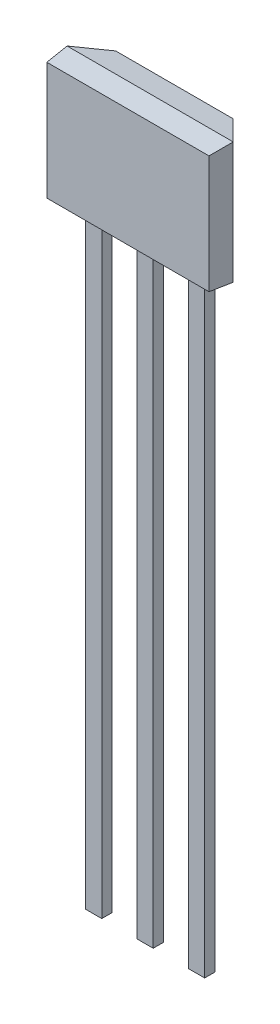
ISO-10303-21;
HEADER;
FILE_DESCRIPTION(('STEP AP214'),'2;1');
FILE_NAME('part.step','',(''),(''),'','','');
FILE_SCHEMA(('AUTOMOTIVE_DESIGN { 1 0 10303 214 1 1 1 1 }'));
ENDSEC;
DATA;
#1=APPLICATION_CONTEXT('core data for automotive mechanical design processes');
#2=APPLICATION_PROTOCOL_DEFINITION('international standard','automotive_design',2000,#1);
#3=PRODUCT_CONTEXT('',#1,'mechanical');
#4=PRODUCT('Part','Part','',(#3));
#5=PRODUCT_RELATED_PRODUCT_CATEGORY('part','',(#4));
#6=PRODUCT_DEFINITION_FORMATION('','',#4);
#7=PRODUCT_DEFINITION_CONTEXT('part definition',#1,'design');
#8=PRODUCT_DEFINITION('design','',#6,#7);
#9=PRODUCT_DEFINITION_SHAPE('','',#8);
#10=(LENGTH_UNIT() NAMED_UNIT(*) SI_UNIT(.MILLI.,.METRE.));
#11=(NAMED_UNIT(*) PLANE_ANGLE_UNIT() SI_UNIT($,.RADIAN.));
#12=(NAMED_UNIT(*) SI_UNIT($,.STERADIAN.) SOLID_ANGLE_UNIT());
#13=UNCERTAINTY_MEASURE_WITH_UNIT(LENGTH_MEASURE(1.E-05),#10,'distance_accuracy_value','');
#14=(GEOMETRIC_REPRESENTATION_CONTEXT(3) GLOBAL_UNCERTAINTY_ASSIGNED_CONTEXT((#13)) GLOBAL_UNIT_ASSIGNED_CONTEXT((#10,
#11,#12)) REPRESENTATION_CONTEXT('',''));
#15=CARTESIAN_POINT('',(0.,0.,0.));
#16=DIRECTION('',(0.,0.,1.));
#17=DIRECTION('',(1.,0.,0.));
#18=AXIS2_PLACEMENT_3D('',#15,#16,#17);
#19=CARTESIAN_POINT('',(0.,0.79,0.51));
#20=DIRECTION('',(0.,0.,-1.));
#21=DIRECTION('',(-1.,0.,0.));
#22=AXIS2_PLACEMENT_3D('',#19,#20,#21);
#23=CYLINDRICAL_SURFACE('',#22,0.15);
#24=CARTESIAN_POINT('',(0.,0.79,0.51));
#25=DIRECTION('',(0.,0.,1.));
#26=DIRECTION('',(1.,0.,0.));
#27=AXIS2_PLACEMENT_3D('',#24,#25,#26);
#28=CIRCLE('',#27,0.15);
#29=CARTESIAN_POINT('',(0.15,0.79,0.51));
#30=VERTEX_POINT('',#29);
#31=EDGE_CURVE('E12',#30,#30,#28,.T.);
#32=ORIENTED_EDGE('',*,*,#31,.F.);
#33=EDGE_LOOP('',(#32));
#34=FACE_BOUND('',#33,.T.);
#35=CARTESIAN_POINT('',(0.,0.79,0.41));
#36=DIRECTION('',(0.,0.,1.));
#37=DIRECTION('',(1.,0.,0.));
#38=AXIS2_PLACEMENT_3D('',#35,#36,#37);
#39=CIRCLE('',#38,0.15);
#40=CARTESIAN_POINT('',(0.15,0.79,0.41));
#41=VERTEX_POINT('',#40);
#42=EDGE_CURVE('E124',#41,#41,#39,.T.);
#43=ORIENTED_EDGE('',*,*,#42,.T.);
#44=EDGE_LOOP('',(#43));
#45=FACE_BOUND('',#44,.T.);
#46=ADVANCED_FACE('F121',(#34,#45),#23,.T.);
#47=CARTESIAN_POINT('',(0.,0.79,0.51));
#48=DIRECTION('',(0.,0.,1.));
#49=DIRECTION('',(1.,0.,0.));
#50=AXIS2_PLACEMENT_3D('',#47,#48,#49);
#51=PLANE('',#50);
#52=ORIENTED_EDGE('',*,*,#31,.T.);
#53=EDGE_LOOP('',(#52));
#54=FACE_BOUND('',#53,.T.);
#55=ADVANCED_FACE('F136',(#54),#51,.T.);
#56=CARTESIAN_POINT('',(0.,0.79,0.41));
#57=DIRECTION('',(0.,0.,1.));
#58=DIRECTION('',(1.,0.,0.));
#59=AXIS2_PLACEMENT_3D('',#56,#57,#58);
#60=PLANE('',#59);
#61=ORIENTED_EDGE('',*,*,#42,.F.);
#62=EDGE_LOOP('',(#61));
#63=FACE_BOUND('',#62,.T.);
#64=ADVANCED_FACE('F134',(#63),#60,.F.);
#65=CLOSED_SHELL('',(#46,#55,#64));
#66=MANIFOLD_SOLID_BREP('B2',#65);
#67=CARTESIAN_POINT('',(1.47,-1.4,0.475));
#68=DIRECTION('',(1.,0.,0.));
#69=DIRECTION('',(0.,0.,-1.));
#70=AXIS2_PLACEMENT_3D('',#67,#68,#69);
#71=PLANE('',#70);
#72=DIRECTION('',(0.,0.,1.));
#73=VECTOR('',#72,1.);
#74=CARTESIAN_POINT('',(1.47,-1.4,0.475));
#75=LINE('',#74,#73);
#76=CARTESIAN_POINT('',(1.47,-1.4,0.475));
#77=VERTEX_POINT('',#76);
#78=CARTESIAN_POINT('',(1.47,-1.4,0.725));
#79=VERTEX_POINT('',#78);
#80=EDGE_CURVE('E192',#77,#79,#75,.T.);
#81=ORIENTED_EDGE('',*,*,#80,.T.);
#82=DIRECTION('',(0.,1.,0.));
#83=VECTOR('',#82,1.);
#84=CARTESIAN_POINT('',(1.47,-1.4,0.725));
#85=LINE('',#84,#83);
#86=CARTESIAN_POINT('',(1.47,-16.6,0.725));
#87=VERTEX_POINT('',#86);
#88=EDGE_CURVE('E119',#87,#79,#85,.T.);
#89=ORIENTED_EDGE('',*,*,#88,.F.);
#90=DIRECTION('',(0.,0.,1.));
#91=VECTOR('',#90,1.);
#92=CARTESIAN_POINT('',(1.47,-16.6,0.475));
#93=LINE('',#92,#91);
#94=CARTESIAN_POINT('',(1.47,-16.6,0.475));
#95=VERTEX_POINT('',#94);
#96=EDGE_CURVE('E216',#95,#87,#93,.T.);
#97=ORIENTED_EDGE('',*,*,#96,.F.);
#98=DIRECTION('',(0.,1.,0.));
#99=VECTOR('',#98,1.);
#100=CARTESIAN_POINT('',(1.47,-1.4,0.475));
#101=LINE('',#100,#99);
#102=EDGE_CURVE('E218',#95,#77,#101,.T.);
#103=ORIENTED_EDGE('',*,*,#102,.T.);
#104=EDGE_LOOP('',(#81,#89,#97,#103));
#105=FACE_BOUND('',#104,.T.);
#106=ADVANCED_FACE('F177',(#105),#71,.T.);
#107=CARTESIAN_POINT('',(1.07,-16.6,0.475));
#108=DIRECTION('',(0.,-1.,0.));
#109=DIRECTION('',(0.,0.,-1.));
#110=AXIS2_PLACEMENT_3D('',#107,#108,#109);
#111=PLANE('',#110);
#112=ORIENTED_EDGE('',*,*,#96,.T.);
#113=DIRECTION('',(1.,0.,0.));
#114=VECTOR('',#113,1.);
#115=CARTESIAN_POINT('',(1.07,-16.6,0.725));
#116=LINE('',#115,#114);
#117=CARTESIAN_POINT('',(1.07,-16.6,0.725));
#118=VERTEX_POINT('',#117);
#119=EDGE_CURVE('E232',#118,#87,#116,.T.);
#120=ORIENTED_EDGE('',*,*,#119,.F.);
#121=DIRECTION('',(0.,0.,1.));
#122=VECTOR('',#121,1.);
#123=CARTESIAN_POINT('',(1.07,-16.6,0.475));
#124=LINE('',#123,#122);
#125=CARTESIAN_POINT('',(1.07,-16.6,0.475));
#126=VERTEX_POINT('',#125);
#127=EDGE_CURVE('E223',#126,#118,#124,.T.);
#128=ORIENTED_EDGE('',*,*,#127,.F.);
#129=DIRECTION('',(1.,0.,0.));
#130=VECTOR('',#129,1.);
#131=CARTESIAN_POINT('',(1.07,-16.6,0.475));
#132=LINE('',#131,#130);
#133=EDGE_CURVE('E230',#126,#95,#132,.T.);
#134=ORIENTED_EDGE('',*,*,#133,.T.);
#135=EDGE_LOOP('',(#112,#120,#128,#134));
#136=FACE_BOUND('',#135,.T.);
#137=ADVANCED_FACE('F234',(#136),#111,.T.);
#138=CARTESIAN_POINT('',(1.07,-1.4,0.475));
#139=DIRECTION('',(-1.,0.,0.));
#140=DIRECTION('',(0.,-1.,0.));
#141=AXIS2_PLACEMENT_3D('',#138,#139,#140);
#142=PLANE('',#141);
#143=ORIENTED_EDGE('',*,*,#127,.T.);
#144=DIRECTION('',(0.,-1.,0.));
#145=VECTOR('',#144,1.);
#146=CARTESIAN_POINT('',(1.07,-1.4,0.725));
#147=LINE('',#146,#145);
#148=CARTESIAN_POINT('',(1.07,-1.4,0.725));
#149=VERTEX_POINT('',#148);
#150=EDGE_CURVE('E244',#149,#118,#147,.T.);
#151=ORIENTED_EDGE('',*,*,#150,.F.);
#152=DIRECTION('',(0.,0.,1.));
#153=VECTOR('',#152,1.);
#154=CARTESIAN_POINT('',(1.07,-1.4,0.475));
#155=LINE('',#154,#153);
#156=CARTESIAN_POINT('',(1.07,-1.4,0.475));
#157=VERTEX_POINT('',#156);
#158=EDGE_CURVE('E199',#157,#149,#155,.T.);
#159=ORIENTED_EDGE('',*,*,#158,.F.);
#160=DIRECTION('',(0.,-1.,0.));
#161=VECTOR('',#160,1.);
#162=CARTESIAN_POINT('',(1.07,-1.4,0.475));
#163=LINE('',#162,#161);
#164=EDGE_CURVE('E236',#157,#126,#163,.T.);
#165=ORIENTED_EDGE('',*,*,#164,.T.);
#166=EDGE_LOOP('',(#143,#151,#159,#165));
#167=FACE_BOUND('',#166,.T.);
#168=ADVANCED_FACE('F249',(#167),#142,.T.);
#169=CARTESIAN_POINT('',(1.07,-1.4,0.475));
#170=DIRECTION('',(0.,1.,0.));
#171=DIRECTION('',(0.,0.,1.));
#172=AXIS2_PLACEMENT_3D('',#169,#170,#171);
#173=PLANE('',#172);
#174=ORIENTED_EDGE('',*,*,#158,.T.);
#175=DIRECTION('',(-1.,0.,0.));
#176=VECTOR('',#175,1.);
#177=CARTESIAN_POINT('',(1.07,-1.4,0.725));
#178=LINE('',#177,#176);
#179=EDGE_CURVE('E185',#79,#149,#178,.T.);
#180=ORIENTED_EDGE('',*,*,#179,.F.);
#181=ORIENTED_EDGE('',*,*,#80,.F.);
#182=DIRECTION('',(-1.,0.,0.));
#183=VECTOR('',#182,1.);
#184=CARTESIAN_POINT('',(1.07,-1.4,0.475));
#185=LINE('',#184,#183);
#186=EDGE_CURVE('E231',#77,#157,#185,.T.);
#187=ORIENTED_EDGE('',*,*,#186,.T.);
#188=EDGE_LOOP('',(#174,#180,#181,#187));
#189=FACE_BOUND('',#188,.T.);
#190=ADVANCED_FACE('F251',(#189),#173,.T.);
#191=CARTESIAN_POINT('',(0.,0.,0.475));
#192=DIRECTION('',(0.,0.,1.));
#193=DIRECTION('',(1.,0.,0.));
#194=AXIS2_PLACEMENT_3D('',#191,#192,#193);
#195=PLANE('',#194);
#196=ORIENTED_EDGE('',*,*,#102,.F.);
#197=ORIENTED_EDGE('',*,*,#133,.F.);
#198=ORIENTED_EDGE('',*,*,#164,.F.);
#199=ORIENTED_EDGE('',*,*,#186,.F.);
#200=EDGE_LOOP('',(#196,#197,#198,#199));
#201=FACE_BOUND('',#200,.T.);
#202=ADVANCED_FACE('F228',(#201),#195,.F.);
#203=CARTESIAN_POINT('',(0.,0.,0.725));
#204=DIRECTION('',(0.,0.,1.));
#205=DIRECTION('',(1.,0.,0.));
#206=AXIS2_PLACEMENT_3D('',#203,#204,#205);
#207=PLANE('',#206);
#208=ORIENTED_EDGE('',*,*,#88,.T.);
#209=ORIENTED_EDGE('',*,*,#179,.T.);
#210=ORIENTED_EDGE('',*,*,#150,.T.);
#211=ORIENTED_EDGE('',*,*,#119,.T.);
#212=EDGE_LOOP('',(#208,#209,#210,#211));
#213=FACE_BOUND('',#212,.T.);
#214=ADVANCED_FACE('F179',(#213),#207,.T.);
#215=CLOSED_SHELL('',(#106,#137,#168,#190,#202,#214));
#216=MANIFOLD_SOLID_BREP('B7',#215);
#217=CARTESIAN_POINT('',(0.2,-1.4,0.475));
#218=DIRECTION('',(1.,0.,0.));
#219=DIRECTION('',(0.,1.,0.));
#220=AXIS2_PLACEMENT_3D('',#217,#218,#219);
#221=PLANE('',#220);
#222=DIRECTION('',(0.,0.,1.));
#223=VECTOR('',#222,1.);
#224=CARTESIAN_POINT('',(0.2,-1.4,0.475));
#225=LINE('',#224,#223);
#226=CARTESIAN_POINT('',(0.2,-1.4,0.475));
#227=VERTEX_POINT('',#226);
#228=CARTESIAN_POINT('',(0.2,-1.4,0.725));
#229=VERTEX_POINT('',#228);
#230=EDGE_CURVE('E337',#227,#229,#225,.T.);
#231=ORIENTED_EDGE('',*,*,#230,.T.);
#232=DIRECTION('',(0.,1.,0.));
#233=VECTOR('',#232,1.);
#234=CARTESIAN_POINT('',(0.2,-1.4,0.725));
#235=LINE('',#234,#233);
#236=CARTESIAN_POINT('',(0.200000000000002,-16.6,0.725));
#237=VERTEX_POINT('',#236);
#238=EDGE_CURVE('E175',#237,#229,#235,.T.);
#239=ORIENTED_EDGE('',*,*,#238,.F.);
#240=DIRECTION('',(0.,0.,1.));
#241=VECTOR('',#240,1.);
#242=CARTESIAN_POINT('',(0.200000000000002,-16.6,0.475));
#243=LINE('',#242,#241);
#244=CARTESIAN_POINT('',(0.200000000000002,-16.6,0.475));
#245=VERTEX_POINT('',#244);
#246=EDGE_CURVE('E361',#245,#237,#243,.T.);
#247=ORIENTED_EDGE('',*,*,#246,.F.);
#248=DIRECTION('',(0.,1.,0.));
#249=VECTOR('',#248,1.);
#250=CARTESIAN_POINT('',(0.2,-1.4,0.475));
#251=LINE('',#250,#249);
#252=EDGE_CURVE('E363',#245,#227,#251,.T.);
#253=ORIENTED_EDGE('',*,*,#252,.T.);
#254=EDGE_LOOP('',(#231,#239,#247,#253));
#255=FACE_BOUND('',#254,.T.);
#256=ADVANCED_FACE('F322',(#255),#221,.T.);
#257=CARTESIAN_POINT('',(-0.199999999999998,-16.6,0.475));
#258=DIRECTION('',(0.,-1.,0.));
#259=DIRECTION('',(1.,0.,0.));
#260=AXIS2_PLACEMENT_3D('',#257,#258,#259);
#261=PLANE('',#260);
#262=ORIENTED_EDGE('',*,*,#246,.T.);
#263=DIRECTION('',(1.,0.,0.));
#264=VECTOR('',#263,1.);
#265=CARTESIAN_POINT('',(-0.199999999999998,-16.6,0.725));
#266=LINE('',#265,#264);
#267=CARTESIAN_POINT('',(-0.199999999999998,-16.6,0.725));
#268=VERTEX_POINT('',#267);
#269=EDGE_CURVE('E377',#268,#237,#266,.T.);
#270=ORIENTED_EDGE('',*,*,#269,.F.);
#271=DIRECTION('',(0.,0.,1.));
#272=VECTOR('',#271,1.);
#273=CARTESIAN_POINT('',(-0.199999999999998,-16.6,0.475));
#274=LINE('',#273,#272);
#275=CARTESIAN_POINT('',(-0.199999999999998,-16.6,0.475));
#276=VERTEX_POINT('',#275);
#277=EDGE_CURVE('E368',#276,#268,#274,.T.);
#278=ORIENTED_EDGE('',*,*,#277,.F.);
#279=DIRECTION('',(1.,0.,0.));
#280=VECTOR('',#279,1.);
#281=CARTESIAN_POINT('',(-0.199999999999998,-16.6,0.475));
#282=LINE('',#281,#280);
#283=EDGE_CURVE('E375',#276,#245,#282,.T.);
#284=ORIENTED_EDGE('',*,*,#283,.T.);
#285=EDGE_LOOP('',(#262,#270,#278,#284));
#286=FACE_BOUND('',#285,.T.);
#287=ADVANCED_FACE('F379',(#286),#261,.T.);
#288=CARTESIAN_POINT('',(-0.2,-1.4,0.475));
#289=DIRECTION('',(-1.,0.,0.));
#290=DIRECTION('',(0.,-1.,0.));
#291=AXIS2_PLACEMENT_3D('',#288,#289,#290);
#292=PLANE('',#291);
#293=ORIENTED_EDGE('',*,*,#277,.T.);
#294=DIRECTION('',(0.,-1.,0.));
#295=VECTOR('',#294,1.);
#296=CARTESIAN_POINT('',(-0.2,-1.4,0.725));
#297=LINE('',#296,#295);
#298=CARTESIAN_POINT('',(-0.2,-1.4,0.725));
#299=VERTEX_POINT('',#298);
#300=EDGE_CURVE('E389',#299,#268,#297,.T.);
#301=ORIENTED_EDGE('',*,*,#300,.F.);
#302=DIRECTION('',(0.,0.,1.));
#303=VECTOR('',#302,1.);
#304=CARTESIAN_POINT('',(-0.2,-1.4,0.475));
#305=LINE('',#304,#303);
#306=CARTESIAN_POINT('',(-0.2,-1.4,0.475));
#307=VERTEX_POINT('',#306);
#308=EDGE_CURVE('E344',#307,#299,#305,.T.);
#309=ORIENTED_EDGE('',*,*,#308,.F.);
#310=DIRECTION('',(0.,-1.,0.));
#311=VECTOR('',#310,1.);
#312=CARTESIAN_POINT('',(-0.2,-1.4,0.475));
#313=LINE('',#312,#311);
#314=EDGE_CURVE('E381',#307,#276,#313,.T.);
#315=ORIENTED_EDGE('',*,*,#314,.T.);
#316=EDGE_LOOP('',(#293,#301,#309,#315));
#317=FACE_BOUND('',#316,.T.);
#318=ADVANCED_FACE('F394',(#317),#292,.T.);
#319=CARTESIAN_POINT('',(-0.2,-1.4,0.475));
#320=DIRECTION('',(0.,1.,0.));
#321=DIRECTION('',(-1.,0.,0.));
#322=AXIS2_PLACEMENT_3D('',#319,#320,#321);
#323=PLANE('',#322);
#324=ORIENTED_EDGE('',*,*,#308,.T.);
#325=DIRECTION('',(-1.,0.,0.));
#326=VECTOR('',#325,1.);
#327=CARTESIAN_POINT('',(-0.2,-1.4,0.725));
#328=LINE('',#327,#326);
#329=EDGE_CURVE('E330',#229,#299,#328,.T.);
#330=ORIENTED_EDGE('',*,*,#329,.F.);
#331=ORIENTED_EDGE('',*,*,#230,.F.);
#332=DIRECTION('',(-1.,0.,0.));
#333=VECTOR('',#332,1.);
#334=CARTESIAN_POINT('',(-0.2,-1.4,0.475));
#335=LINE('',#334,#333);
#336=EDGE_CURVE('E376',#227,#307,#335,.T.);
#337=ORIENTED_EDGE('',*,*,#336,.T.);
#338=EDGE_LOOP('',(#324,#330,#331,#337));
#339=FACE_BOUND('',#338,.T.);
#340=ADVANCED_FACE('F396',(#339),#323,.T.);
#341=CARTESIAN_POINT('',(0.,0.,0.475));
#342=DIRECTION('',(0.,0.,1.));
#343=DIRECTION('',(1.,0.,0.));
#344=AXIS2_PLACEMENT_3D('',#341,#342,#343);
#345=PLANE('',#344);
#346=ORIENTED_EDGE('',*,*,#252,.F.);
#347=ORIENTED_EDGE('',*,*,#283,.F.);
#348=ORIENTED_EDGE('',*,*,#314,.F.);
#349=ORIENTED_EDGE('',*,*,#336,.F.);
#350=EDGE_LOOP('',(#346,#347,#348,#349));
#351=FACE_BOUND('',#350,.T.);
#352=ADVANCED_FACE('F373',(#351),#345,.F.);
#353=CARTESIAN_POINT('',(0.,0.,0.725));
#354=DIRECTION('',(0.,0.,1.));
#355=DIRECTION('',(1.,0.,0.));
#356=AXIS2_PLACEMENT_3D('',#353,#354,#355);
#357=PLANE('',#356);
#358=ORIENTED_EDGE('',*,*,#238,.T.);
#359=ORIENTED_EDGE('',*,*,#329,.T.);
#360=ORIENTED_EDGE('',*,*,#300,.T.);
#361=ORIENTED_EDGE('',*,*,#269,.T.);
#362=EDGE_LOOP('',(#358,#359,#360,#361));
#363=FACE_BOUND('',#362,.T.);
#364=ADVANCED_FACE('F324',(#363),#357,.T.);
#365=CLOSED_SHELL('',(#256,#287,#318,#340,#352,#364));
#366=MANIFOLD_SOLID_BREP('B113',#365);
#367=CARTESIAN_POINT('',(-1.07,-1.4,0.475));
#368=DIRECTION('',(1.,0.,0.));
#369=DIRECTION('',(0.,1.,0.));
#370=AXIS2_PLACEMENT_3D('',#367,#368,#369);
#371=PLANE('',#370);
#372=DIRECTION('',(0.,0.,1.));
#373=VECTOR('',#372,1.);
#374=CARTESIAN_POINT('',(-1.07,-1.4,0.475));
#375=LINE('',#374,#373);
#376=CARTESIAN_POINT('',(-1.07,-1.4,0.475));
#377=VERTEX_POINT('',#376);
#378=CARTESIAN_POINT('',(-1.07,-1.4,0.725));
#379=VERTEX_POINT('',#378);
#380=EDGE_CURVE('E469',#377,#379,#375,.T.);
#381=ORIENTED_EDGE('',*,*,#380,.T.);
#382=DIRECTION('',(0.,1.,0.));
#383=VECTOR('',#382,1.);
#384=CARTESIAN_POINT('',(-1.07,-1.4,0.725));
#385=LINE('',#384,#383);
#386=CARTESIAN_POINT('',(-1.07,-16.6,0.725));
#387=VERTEX_POINT('',#386);
#388=EDGE_CURVE('E506',#387,#379,#385,.T.);
#389=ORIENTED_EDGE('',*,*,#388,.F.);
#390=DIRECTION('',(0.,0.,1.));
#391=VECTOR('',#390,1.);
#392=CARTESIAN_POINT('',(-1.07,-16.6,0.475));
#393=LINE('',#392,#391);
#394=CARTESIAN_POINT('',(-1.07,-16.6,0.475));
#395=VERTEX_POINT('',#394);
#396=EDGE_CURVE('E320',#395,#387,#393,.T.);
#397=ORIENTED_EDGE('',*,*,#396,.F.);
#398=DIRECTION('',(0.,1.,0.));
#399=VECTOR('',#398,1.);
#400=CARTESIAN_POINT('',(-1.07,-1.4,0.475));
#401=LINE('',#400,#399);
#402=EDGE_CURVE('E507',#395,#377,#401,.T.);
#403=ORIENTED_EDGE('',*,*,#402,.T.);
#404=EDGE_LOOP('',(#381,#389,#397,#403));
#405=FACE_BOUND('',#404,.T.);
#406=ADVANCED_FACE('F466',(#405),#371,.T.);
#407=CARTESIAN_POINT('',(-1.47,-16.6,0.475));
#408=DIRECTION('',(0.,-1.,0.));
#409=DIRECTION('',(0.,0.,-1.));
#410=AXIS2_PLACEMENT_3D('',#407,#408,#409);
#411=PLANE('',#410);
#412=ORIENTED_EDGE('',*,*,#396,.T.);
#413=DIRECTION('',(1.,0.,0.));
#414=VECTOR('',#413,1.);
#415=CARTESIAN_POINT('',(-1.47,-16.6,0.725));
#416=LINE('',#415,#414);
#417=CARTESIAN_POINT('',(-1.47,-16.6,0.725));
#418=VERTEX_POINT('',#417);
#419=EDGE_CURVE('E523',#418,#387,#416,.T.);
#420=ORIENTED_EDGE('',*,*,#419,.F.);
#421=DIRECTION('',(0.,0.,1.));
#422=VECTOR('',#421,1.);
#423=CARTESIAN_POINT('',(-1.47,-16.6,0.475));
#424=LINE('',#423,#422);
#425=CARTESIAN_POINT('',(-1.47,-16.6,0.475));
#426=VERTEX_POINT('',#425);
#427=EDGE_CURVE('E474',#426,#418,#424,.T.);
#428=ORIENTED_EDGE('',*,*,#427,.F.);
#429=DIRECTION('',(1.,0.,0.));
#430=VECTOR('',#429,1.);
#431=CARTESIAN_POINT('',(-1.47,-16.6,0.475));
#432=LINE('',#431,#430);
#433=EDGE_CURVE('E512',#426,#395,#432,.T.);
#434=ORIENTED_EDGE('',*,*,#433,.T.);
#435=EDGE_LOOP('',(#412,#420,#428,#434));
#436=FACE_BOUND('',#435,.T.);
#437=ADVANCED_FACE('F538',(#436),#411,.T.);
#438=CARTESIAN_POINT('',(-1.47,-1.4,0.475));
#439=DIRECTION('',(-1.,0.,0.));
#440=DIRECTION('',(0.,-1.,0.));
#441=AXIS2_PLACEMENT_3D('',#438,#439,#440);
#442=PLANE('',#441);
#443=ORIENTED_EDGE('',*,*,#427,.T.);
#444=DIRECTION('',(0.,-1.,0.));
#445=VECTOR('',#444,1.);
#446=CARTESIAN_POINT('',(-1.47,-1.4,0.725));
#447=LINE('',#446,#445);
#448=CARTESIAN_POINT('',(-1.47,-1.4,0.725));
#449=VERTEX_POINT('',#448);
#450=EDGE_CURVE('E519',#449,#418,#447,.T.);
#451=ORIENTED_EDGE('',*,*,#450,.F.);
#452=DIRECTION('',(0.,0.,1.));
#453=VECTOR('',#452,1.);
#454=CARTESIAN_POINT('',(-1.47,-1.4,0.475));
#455=LINE('',#454,#453);
#456=CARTESIAN_POINT('',(-1.47,-1.4,0.475));
#457=VERTEX_POINT('',#456);
#458=EDGE_CURVE('E511',#457,#449,#455,.T.);
#459=ORIENTED_EDGE('',*,*,#458,.F.);
#460=DIRECTION('',(0.,-1.,0.));
#461=VECTOR('',#460,1.);
#462=CARTESIAN_POINT('',(-1.47,-1.4,0.475));
#463=LINE('',#462,#461);
#464=EDGE_CURVE('E531',#457,#426,#463,.T.);
#465=ORIENTED_EDGE('',*,*,#464,.T.);
#466=EDGE_LOOP('',(#443,#451,#459,#465));
#467=FACE_BOUND('',#466,.T.);
#468=ADVANCED_FACE('F535',(#467),#442,.T.);
#469=CARTESIAN_POINT('',(-1.47,-1.4,0.475));
#470=DIRECTION('',(0.,1.,0.));
#471=DIRECTION('',(0.,0.,1.));
#472=AXIS2_PLACEMENT_3D('',#469,#470,#471);
#473=PLANE('',#472);
#474=ORIENTED_EDGE('',*,*,#458,.T.);
#475=DIRECTION('',(-1.,0.,0.));
#476=VECTOR('',#475,1.);
#477=CARTESIAN_POINT('',(-1.47,-1.4,0.725));
#478=LINE('',#477,#476);
#479=EDGE_CURVE('E514',#379,#449,#478,.T.);
#480=ORIENTED_EDGE('',*,*,#479,.F.);
#481=ORIENTED_EDGE('',*,*,#380,.F.);
#482=DIRECTION('',(-1.,0.,0.));
#483=VECTOR('',#482,1.);
#484=CARTESIAN_POINT('',(-1.47,-1.4,0.475));
#485=LINE('',#484,#483);
#486=EDGE_CURVE('E529',#377,#457,#485,.T.);
#487=ORIENTED_EDGE('',*,*,#486,.T.);
#488=EDGE_LOOP('',(#474,#480,#481,#487));
#489=FACE_BOUND('',#488,.T.);
#490=ADVANCED_FACE('F515',(#489),#473,.T.);
#491=CARTESIAN_POINT('',(0.,0.,0.475));
#492=DIRECTION('',(0.,0.,1.));
#493=DIRECTION('',(1.,0.,0.));
#494=AXIS2_PLACEMENT_3D('',#491,#492,#493);
#495=PLANE('',#494);
#496=ORIENTED_EDGE('',*,*,#402,.F.);
#497=ORIENTED_EDGE('',*,*,#433,.F.);
#498=ORIENTED_EDGE('',*,*,#464,.F.);
#499=ORIENTED_EDGE('',*,*,#486,.F.);
#500=EDGE_LOOP('',(#496,#497,#498,#499));
#501=FACE_BOUND('',#500,.T.);
#502=ADVANCED_FACE('F540',(#501),#495,.F.);
#503=CARTESIAN_POINT('',(0.,0.,0.725));
#504=DIRECTION('',(0.,0.,1.));
#505=DIRECTION('',(1.,0.,0.));
#506=AXIS2_PLACEMENT_3D('',#503,#504,#505);
#507=PLANE('',#506);
#508=ORIENTED_EDGE('',*,*,#388,.T.);
#509=ORIENTED_EDGE('',*,*,#479,.T.);
#510=ORIENTED_EDGE('',*,*,#450,.T.);
#511=ORIENTED_EDGE('',*,*,#419,.T.);
#512=EDGE_LOOP('',(#508,#509,#510,#511));
#513=FACE_BOUND('',#512,.T.);
#514=ADVANCED_FACE('F522',(#513),#507,.T.);
#515=CLOSED_SHELL('',(#406,#437,#468,#490,#502,#514));
#516=MANIFOLD_SOLID_BREP('B169',#515);
#517=CARTESIAN_POINT('',(0.,0.,0.));
#518=DIRECTION('',(0.,0.,1.));
#519=DIRECTION('',(1.,0.,0.));
#520=AXIS2_PLACEMENT_3D('',#517,#518,#519);
#521=PLANE('',#520);
#522=DIRECTION('',(1.,0.,0.));
#523=VECTOR('',#522,1.);
#524=CARTESIAN_POINT('',(-2.05,-1.39420381157493,0.));
#525=LINE('',#524,#523);
#526=CARTESIAN_POINT('',(-1.45000000000001,-1.39420381157493,0.));
#527=VERTEX_POINT('',#526);
#528=CARTESIAN_POINT('',(1.45000000000001,-1.39420381157493,0.));
#529=VERTEX_POINT('',#528);
#530=EDGE_CURVE('E670',#527,#529,#525,.T.);
#531=ORIENTED_EDGE('',*,*,#530,.F.);
#532=DIRECTION('',(0.,-1.,0.));
#533=VECTOR('',#532,1.);
#534=CARTESIAN_POINT('',(-1.45000000000001,1.5,0.));
#535=LINE('',#534,#533);
#536=CARTESIAN_POINT('',(-1.45000000000001,1.39420381157493,0.));
#537=VERTEX_POINT('',#536);
#538=EDGE_CURVE('E669',#537,#527,#535,.T.);
#539=ORIENTED_EDGE('',*,*,#538,.F.);
#540=DIRECTION('',(1.,0.,0.));
#541=VECTOR('',#540,1.);
#542=CARTESIAN_POINT('',(-2.05,1.39420381157493,0.));
#543=LINE('',#542,#541);
#544=CARTESIAN_POINT('',(1.45000000000001,1.39420381157493,0.));
#545=VERTEX_POINT('',#544);
#546=EDGE_CURVE('E709',#537,#545,#543,.T.);
#547=ORIENTED_EDGE('',*,*,#546,.T.);
#548=DIRECTION('',(0.,-1.,0.));
#549=VECTOR('',#548,1.);
#550=CARTESIAN_POINT('',(1.45000000000001,1.5,0.));
#551=LINE('',#550,#549);
#552=EDGE_CURVE('E685',#545,#529,#551,.T.);
#553=ORIENTED_EDGE('',*,*,#552,.T.);
#554=EDGE_LOOP('',(#531,#539,#547,#553));
#555=FACE_BOUND('',#554,.T.);
#556=ADVANCED_FACE('F601',(#555),#521,.F.);
#557=CARTESIAN_POINT('',(0.725000000000011,1.5,-0.725000000000003));
#558=DIRECTION('',(-0.707106781186551,0.,0.707106781186544));
#559=DIRECTION('',(0.707106781186544,0.,0.707106781186551));
#560=AXIS2_PLACEMENT_3D('',#557,#558,#559);
#561=PLANE('',#560);
#562=DIRECTION('',(0.70167384315986,-0.123724030206479,0.701673843159868));
#563=VECTOR('',#562,1.);
#564=CARTESIAN_POINT('',(0.484840869938347,-1.22402021626795,-0.96515913006167));
#565=LINE('',#564,#563);
#566=CARTESIAN_POINT('',(2.05,-1.5,0.6));
#567=VERTEX_POINT('',#566);
#568=EDGE_CURVE('E623',#529,#567,#565,.T.);
#569=ORIENTED_EDGE('',*,*,#568,.F.);
#570=ORIENTED_EDGE('',*,*,#552,.F.);
#571=DIRECTION('',(0.70167384315986,0.123724030206479,0.701673843159868));
#572=VECTOR('',#571,1.);
#573=CARTESIAN_POINT('',(0.745282617236968,1.26994312321955,-0.704717382763046));
#574=LINE('',#573,#572);
#575=CARTESIAN_POINT('',(2.05,1.5,0.6));
#576=VERTEX_POINT('',#575);
#577=EDGE_CURVE('E700',#545,#576,#574,.T.);
#578=ORIENTED_EDGE('',*,*,#577,.T.);
#579=DIRECTION('',(0.,-1.,0.));
#580=VECTOR('',#579,1.);
#581=CARTESIAN_POINT('',(2.05,1.5,0.6));
#582=LINE('',#581,#580);
#583=EDGE_CURVE('E679',#576,#567,#582,.T.);
#584=ORIENTED_EDGE('',*,*,#583,.T.);
#585=EDGE_LOOP('',(#569,#570,#578,#584));
#586=FACE_BOUND('',#585,.T.);
#587=ADVANCED_FACE('F713',(#586),#561,.F.);
#588=CARTESIAN_POINT('',(-0.725000000000011,1.5,-0.725000000000003));
#589=DIRECTION('',(-0.707106781186551,0.,-0.707106781186544));
#590=DIRECTION('',(-0.707106781186544,0.,0.707106781186551));
#591=AXIS2_PLACEMENT_3D('',#588,#589,#590);
#592=PLANE('',#591);
#593=ORIENTED_EDGE('',*,*,#538,.T.);
#594=DIRECTION('',(-0.70167384315986,-0.123724030206479,0.701673843159867));
#595=VECTOR('',#594,1.);
#596=CARTESIAN_POINT('',(-0.484840869938347,-1.22402021626795,-0.965159130061669));
#597=LINE('',#596,#595);
#598=CARTESIAN_POINT('',(-2.05,-1.5,0.6));
#599=VERTEX_POINT('',#598);
#600=EDGE_CURVE('E653',#527,#599,#597,.T.);
#601=ORIENTED_EDGE('',*,*,#600,.T.);
#602=DIRECTION('',(0.,-1.,0.));
#603=VECTOR('',#602,1.);
#604=CARTESIAN_POINT('',(-2.05,1.5,0.6));
#605=LINE('',#604,#603);
#606=CARTESIAN_POINT('',(-2.05,1.5,0.6));
#607=VERTEX_POINT('',#606);
#608=EDGE_CURVE('E667',#607,#599,#605,.T.);
#609=ORIENTED_EDGE('',*,*,#608,.F.);
#610=DIRECTION('',(-0.70167384315986,0.123724030206479,0.701673843159868));
#611=VECTOR('',#610,1.);
#612=CARTESIAN_POINT('',(-0.745282617236968,1.26994312321955,-0.704717382763046));
#613=LINE('',#612,#611);
#614=EDGE_CURVE('E704',#537,#607,#613,.T.);
#615=ORIENTED_EDGE('',*,*,#614,.F.);
#616=EDGE_LOOP('',(#593,#601,#609,#615));
#617=FACE_BOUND('',#616,.T.);
#618=ADVANCED_FACE('F664',(#617),#592,.T.);
#619=CARTESIAN_POINT('',(0.,0.,1.15));
#620=DIRECTION('',(0.,0.,1.));
#621=DIRECTION('',(1.,0.,0.));
#622=AXIS2_PLACEMENT_3D('',#619,#620,#621);
#623=PLANE('',#622);
#624=DIRECTION('',(1.,0.,0.));
#625=VECTOR('',#624,1.);
#626=CARTESIAN_POINT('',(-2.05,-1.45188123506075,1.15));
#627=LINE('',#626,#625);
#628=CARTESIAN_POINT('',(-2.00188123506075,-1.45188123506075,1.15));
#629=VERTEX_POINT('',#628);
#630=CARTESIAN_POINT('',(2.00188123506074,-1.45188123506075,1.15));
#631=VERTEX_POINT('',#630);
#632=EDGE_CURVE('E659',#629,#631,#627,.T.);
#633=ORIENTED_EDGE('',*,*,#632,.T.);
#634=DIRECTION('',(0.,-1.,0.));
#635=VECTOR('',#634,1.);
#636=CARTESIAN_POINT('',(2.00188123506075,1.5,1.15));
#637=LINE('',#636,#635);
#638=CARTESIAN_POINT('',(2.00188123506075,1.45188123506075,1.15));
#639=VERTEX_POINT('',#638);
#640=EDGE_CURVE('E694',#639,#631,#637,.T.);
#641=ORIENTED_EDGE('',*,*,#640,.F.);
#642=DIRECTION('',(1.,0.,0.));
#643=VECTOR('',#642,1.);
#644=CARTESIAN_POINT('',(-2.05,1.45188123506075,1.15));
#645=LINE('',#644,#643);
#646=CARTESIAN_POINT('',(-2.00188123506075,1.45188123506075,1.15));
#647=VERTEX_POINT('',#646);
#648=EDGE_CURVE('E615',#647,#639,#645,.T.);
#649=ORIENTED_EDGE('',*,*,#648,.F.);
#650=DIRECTION('',(0.,-1.,0.));
#651=VECTOR('',#650,1.);
#652=CARTESIAN_POINT('',(-2.00188123506075,1.5,1.15));
#653=LINE('',#652,#651);
#654=EDGE_CURVE('E683',#647,#629,#653,.T.);
#655=ORIENTED_EDGE('',*,*,#654,.T.);
#656=EDGE_LOOP('',(#633,#641,#649,#655));
#657=FACE_BOUND('',#656,.T.);
#658=ADVANCED_FACE('F719',(#657),#623,.T.);
#659=CARTESIAN_POINT('',(-2.05,1.5,0.6));
#660=DIRECTION('',(0.996194698091746,0.,-0.0871557427476515));
#661=DIRECTION('',(-0.0871557427476515,0.,-0.996194698091746));
#662=AXIS2_PLACEMENT_3D('',#659,#660,#661);
#663=PLANE('',#662);
#664=ORIENTED_EDGE('',*,*,#608,.T.);
#665=DIRECTION('',(0.086826593864241,0.086826593864241,0.992432509138968));
#666=VECTOR('',#665,1.);
#667=CARTESIAN_POINT('',(-2.0273834277938,-1.4773834277938,0.858508603226036));
#668=LINE('',#667,#666);
#669=EDGE_CURVE('E673',#599,#629,#668,.T.);
#670=ORIENTED_EDGE('',*,*,#669,.T.);
#671=ORIENTED_EDGE('',*,*,#654,.F.);
#672=DIRECTION('',(0.086826593864241,-0.086826593864241,0.992432509138968));
#673=VECTOR('',#672,1.);
#674=CARTESIAN_POINT('',(-2.05,1.5,0.6));
#675=LINE('',#674,#673);
#676=EDGE_CURVE('E658',#607,#647,#675,.T.);
#677=ORIENTED_EDGE('',*,*,#676,.F.);
#678=EDGE_LOOP('',(#664,#670,#671,#677));
#679=FACE_BOUND('',#678,.T.);
#680=ADVANCED_FACE('F682',(#679),#663,.F.);
#681=CARTESIAN_POINT('',(2.05,1.5,0.6));
#682=DIRECTION('',(0.996194698091746,0.,0.0871557427476515));
#683=DIRECTION('',(0.0871557427476515,0.,-0.996194698091746));
#684=AXIS2_PLACEMENT_3D('',#681,#682,#683);
#685=PLANE('',#684);
#686=DIRECTION('',(-0.086826593864241,0.086826593864241,0.992432509138968));
#687=VECTOR('',#686,1.);
#688=CARTESIAN_POINT('',(2.0273834277938,-1.4773834277938,0.858508603226036));
#689=LINE('',#688,#687);
#690=EDGE_CURVE('E464',#567,#631,#689,.T.);
#691=ORIENTED_EDGE('',*,*,#690,.F.);
#692=ORIENTED_EDGE('',*,*,#583,.F.);
#693=DIRECTION('',(-0.086826593864241,-0.086826593864241,0.992432509138968));
#694=VECTOR('',#693,1.);
#695=CARTESIAN_POINT('',(2.05,1.5,0.6));
#696=LINE('',#695,#694);
#697=EDGE_CURVE('E608',#576,#639,#696,.T.);
#698=ORIENTED_EDGE('',*,*,#697,.T.);
#699=ORIENTED_EDGE('',*,*,#640,.T.);
#700=EDGE_LOOP('',(#691,#692,#698,#699));
#701=FACE_BOUND('',#700,.T.);
#702=ADVANCED_FACE('F716',(#701),#685,.T.);
#703=CARTESIAN_POINT('',(-2.05,1.5,0.6));
#704=DIRECTION('',(0.,0.996194698091746,0.0871557427476514));
#705=DIRECTION('',(0.,-0.0871557427476514,0.996194698091746));
#706=AXIS2_PLACEMENT_3D('',#703,#704,#705);
#707=PLANE('',#706);
#708=ORIENTED_EDGE('',*,*,#676,.T.);
#709=ORIENTED_EDGE('',*,*,#648,.T.);
#710=ORIENTED_EDGE('',*,*,#697,.F.);
#711=DIRECTION('',(1.,0.,0.));
#712=VECTOR('',#711,1.);
#713=CARTESIAN_POINT('',(-2.05,1.5,0.6));
#714=LINE('',#713,#712);
#715=EDGE_CURVE('E707',#607,#576,#714,.T.);
#716=ORIENTED_EDGE('',*,*,#715,.F.);
#717=EDGE_LOOP('',(#708,#709,#710,#716));
#718=FACE_BOUND('',#717,.T.);
#719=ADVANCED_FACE('F736',(#718),#707,.T.);
#720=CARTESIAN_POINT('',(-2.05,-1.5,0.6));
#721=DIRECTION('',(0.,0.996194698091746,-0.0871557427476514));
#722=DIRECTION('',(0.,0.0871557427476514,0.996194698091746));
#723=AXIS2_PLACEMENT_3D('',#720,#721,#722);
#724=PLANE('',#723);
#725=DIRECTION('',(1.,0.,0.));
#726=VECTOR('',#725,1.);
#727=CARTESIAN_POINT('',(-2.05,-1.5,0.6));
#728=LINE('',#727,#726);
#729=EDGE_CURVE('E650',#599,#567,#728,.T.);
#730=ORIENTED_EDGE('',*,*,#729,.T.);
#731=ORIENTED_EDGE('',*,*,#690,.T.);
#732=ORIENTED_EDGE('',*,*,#632,.F.);
#733=ORIENTED_EDGE('',*,*,#669,.F.);
#734=EDGE_LOOP('',(#730,#731,#732,#733));
#735=FACE_BOUND('',#734,.T.);
#736=ADVANCED_FACE('F674',(#735),#724,.F.);
#737=CARTESIAN_POINT('',(-2.05,-1.35216342259174,-0.238422893730016));
#738=DIRECTION('',(0.,-0.984807753012209,-0.173648177666923));
#739=DIRECTION('',(0.,0.173648177666923,-0.984807753012209));
#740=AXIS2_PLACEMENT_3D('',#737,#738,#739);
#741=PLANE('',#740);
#742=ORIENTED_EDGE('',*,*,#568,.T.);
#743=ORIENTED_EDGE('',*,*,#729,.F.);
#744=ORIENTED_EDGE('',*,*,#600,.F.);
#745=ORIENTED_EDGE('',*,*,#530,.T.);
#746=EDGE_LOOP('',(#742,#743,#744,#745));
#747=FACE_BOUND('',#746,.T.);
#748=ADVANCED_FACE('F652',(#747),#741,.T.);
#749=CARTESIAN_POINT('',(-2.05,1.5,0.6));
#750=DIRECTION('',(0.,-0.984807753012209,0.173648177666923));
#751=DIRECTION('',(0.,-0.173648177666923,-0.984807753012209));
#752=AXIS2_PLACEMENT_3D('',#749,#750,#751);
#753=PLANE('',#752);
#754=ORIENTED_EDGE('',*,*,#546,.F.);
#755=ORIENTED_EDGE('',*,*,#614,.T.);
#756=ORIENTED_EDGE('',*,*,#715,.T.);
#757=ORIENTED_EDGE('',*,*,#577,.F.);
#758=EDGE_LOOP('',(#754,#755,#756,#757));
#759=FACE_BOUND('',#758,.T.);
#760=ADVANCED_FACE('F742',(#759),#753,.F.);
#761=CLOSED_SHELL('',(#556,#587,#618,#658,#680,#702,#719,#736,#748,#760));
#762=MANIFOLD_SOLID_BREP('B314',#761);
#763=ADVANCED_BREP_SHAPE_REPRESENTATION('',(#18,#66,#216,#366,#516,#762),#14);
#764=SHAPE_DEFINITION_REPRESENTATION(#9,#763);
ENDSEC;
END-ISO-10303-21;
